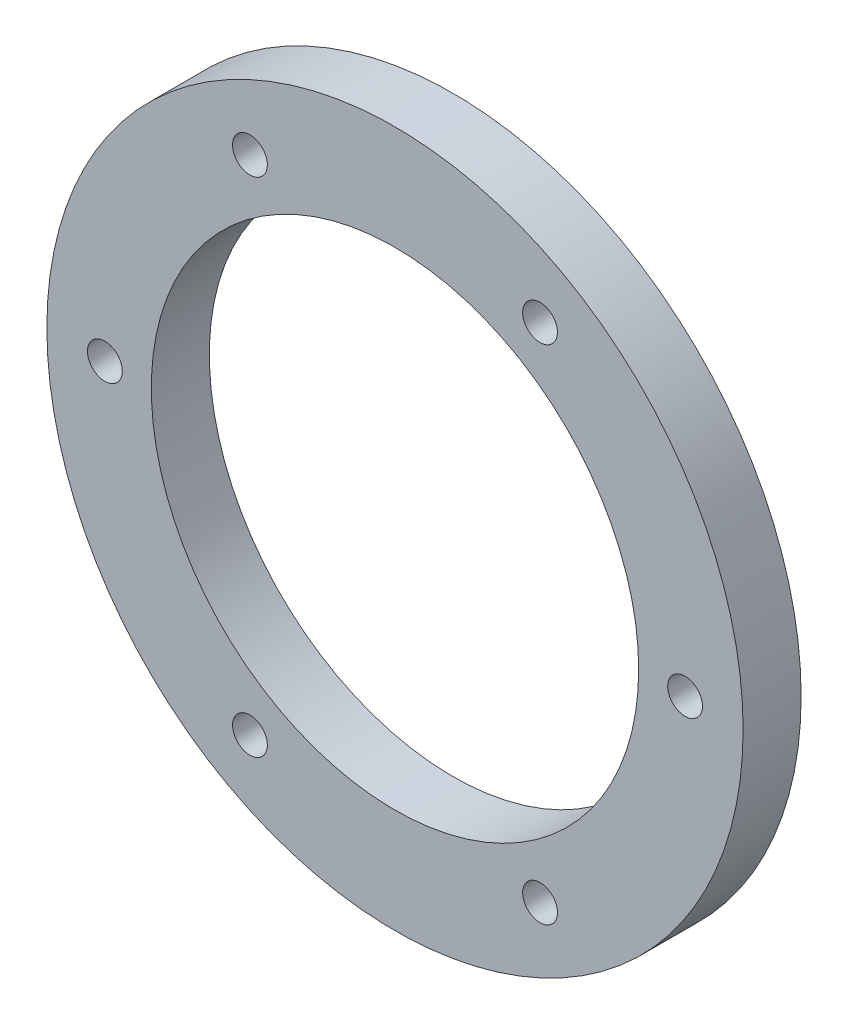
ISO-10303-21;
HEADER;
FILE_DESCRIPTION(('STEP AP214'),'2;1');
FILE_NAME('part.step','',(''),(''),'','','');
FILE_SCHEMA(('AUTOMOTIVE_DESIGN { 1 0 10303 214 1 1 1 1 }'));
ENDSEC;
DATA;
#1=APPLICATION_CONTEXT('core data for automotive mechanical design processes');
#2=APPLICATION_PROTOCOL_DEFINITION('international standard','automotive_design',2000,#1);
#3=PRODUCT_CONTEXT('',#1,'mechanical');
#4=PRODUCT('Part','Part','',(#3));
#5=PRODUCT_RELATED_PRODUCT_CATEGORY('part','',(#4));
#6=PRODUCT_DEFINITION_FORMATION('','',#4);
#7=PRODUCT_DEFINITION_CONTEXT('part definition',#1,'design');
#8=PRODUCT_DEFINITION('design','',#6,#7);
#9=PRODUCT_DEFINITION_SHAPE('','',#8);
#10=(LENGTH_UNIT() NAMED_UNIT(*) SI_UNIT(.MILLI.,.METRE.));
#11=(NAMED_UNIT(*) PLANE_ANGLE_UNIT() SI_UNIT($,.RADIAN.));
#12=(NAMED_UNIT(*) SI_UNIT($,.STERADIAN.) SOLID_ANGLE_UNIT());
#13=UNCERTAINTY_MEASURE_WITH_UNIT(LENGTH_MEASURE(1.E-05),#10,'distance_accuracy_value','');
#14=(GEOMETRIC_REPRESENTATION_CONTEXT(3) GLOBAL_UNCERTAINTY_ASSIGNED_CONTEXT((#13)) GLOBAL_UNIT_ASSIGNED_CONTEXT((#10,
#11,#12)) REPRESENTATION_CONTEXT('',''));
#15=CARTESIAN_POINT('',(0.,0.,0.));
#16=DIRECTION('',(0.,0.,1.));
#17=DIRECTION('',(1.,0.,0.));
#18=AXIS2_PLACEMENT_3D('',#15,#16,#17);
#19=CARTESIAN_POINT('',(0.,0.,5.));
#20=DIRECTION('',(0.,0.,1.));
#21=DIRECTION('',(1.,0.,0.));
#22=AXIS2_PLACEMENT_3D('',#19,#20,#21);
#23=PLANE('',#22);
#24=CARTESIAN_POINT('',(25.,0.,5.));
#25=DIRECTION('',(0.,0.,1.));
#26=DIRECTION('',(1.,0.,0.));
#27=AXIS2_PLACEMENT_3D('',#24,#25,#26);
#28=CIRCLE('',#27,1.5);
#29=CARTESIAN_POINT('',(26.5,0.,5.));
#30=VERTEX_POINT('',#29);
#31=EDGE_CURVE('E72',#30,#30,#28,.T.);
#32=ORIENTED_EDGE('',*,*,#31,.F.);
#33=EDGE_LOOP('',(#32));
#34=FACE_BOUND('',#33,.T.);
#35=CARTESIAN_POINT('',(-12.4999999999999,-21.650635094611,5.));
#36=DIRECTION('',(0.,0.,1.));
#37=DIRECTION('',(1.,0.,0.));
#38=AXIS2_PLACEMENT_3D('',#35,#36,#37);
#39=CIRCLE('',#38,1.5);
#40=CARTESIAN_POINT('',(-10.9999999999999,-21.650635094611,5.));
#41=VERTEX_POINT('',#40);
#42=EDGE_CURVE('E60',#41,#41,#39,.T.);
#43=ORIENTED_EDGE('',*,*,#42,.F.);
#44=EDGE_LOOP('',(#43));
#45=FACE_BOUND('',#44,.T.);
#46=CARTESIAN_POINT('',(-12.5000000000001,21.6506350946109,5.));
#47=DIRECTION('',(0.,0.,1.));
#48=DIRECTION('',(1.,0.,0.));
#49=AXIS2_PLACEMENT_3D('',#46,#47,#48);
#50=CIRCLE('',#49,1.50000000000001);
#51=CARTESIAN_POINT('',(-11.0000000000001,21.6506350946109,5.));
#52=VERTEX_POINT('',#51);
#53=EDGE_CURVE('E48',#52,#52,#50,.T.);
#54=ORIENTED_EDGE('',*,*,#53,.F.);
#55=EDGE_LOOP('',(#54));
#56=FACE_BOUND('',#55,.T.);
#57=CARTESIAN_POINT('',(0.,0.,5.));
#58=DIRECTION('',(0.,0.,1.));
#59=DIRECTION('',(1.,0.,0.));
#60=AXIS2_PLACEMENT_3D('',#57,#58,#59);
#61=CIRCLE('',#60,30.);
#62=CARTESIAN_POINT('',(30.,0.,5.));
#63=VERTEX_POINT('',#62);
#64=EDGE_CURVE('E10',#63,#63,#61,.T.);
#65=ORIENTED_EDGE('',*,*,#64,.T.);
#66=EDGE_LOOP('',(#65));
#67=FACE_BOUND('',#66,.T.);
#68=CARTESIAN_POINT('',(0.,0.,5.));
#69=DIRECTION('',(0.,0.,1.));
#70=DIRECTION('',(1.,0.,0.));
#71=AXIS2_PLACEMENT_3D('',#68,#69,#70);
#72=CIRCLE('',#71,21.);
#73=CARTESIAN_POINT('',(21.,0.,5.));
#74=VERTEX_POINT('',#73);
#75=EDGE_CURVE('E43',#74,#74,#72,.T.);
#76=ORIENTED_EDGE('',*,*,#75,.F.);
#77=EDGE_LOOP('',(#76));
#78=FACE_BOUND('',#77,.T.);
#79=CARTESIAN_POINT('',(-25.,0.,5.));
#80=DIRECTION('',(0.,0.,1.));
#81=DIRECTION('',(1.,0.,0.));
#82=AXIS2_PLACEMENT_3D('',#79,#80,#81);
#83=CIRCLE('',#82,1.5);
#84=CARTESIAN_POINT('',(-23.5,0.,5.));
#85=VERTEX_POINT('',#84);
#86=EDGE_CURVE('E54',#85,#85,#83,.T.);
#87=ORIENTED_EDGE('',*,*,#86,.F.);
#88=EDGE_LOOP('',(#87));
#89=FACE_BOUND('',#88,.T.);
#90=CARTESIAN_POINT('',(12.5000000000001,-21.6506350946109,5.));
#91=DIRECTION('',(0.,0.,1.));
#92=DIRECTION('',(1.,0.,0.));
#93=AXIS2_PLACEMENT_3D('',#90,#91,#92);
#94=CIRCLE('',#93,1.5);
#95=CARTESIAN_POINT('',(14.0000000000001,-21.6506350946109,5.));
#96=VERTEX_POINT('',#95);
#97=EDGE_CURVE('E66',#96,#96,#94,.T.);
#98=ORIENTED_EDGE('',*,*,#97,.F.);
#99=EDGE_LOOP('',(#98));
#100=FACE_BOUND('',#99,.T.);
#101=CARTESIAN_POINT('',(12.4999999999999,21.650635094611,5.));
#102=DIRECTION('',(0.,0.,1.));
#103=DIRECTION('',(1.,0.,0.));
#104=AXIS2_PLACEMENT_3D('',#101,#102,#103);
#105=CIRCLE('',#104,1.5);
#106=CARTESIAN_POINT('',(13.9999999999999,21.650635094611,5.));
#107=VERTEX_POINT('',#106);
#108=EDGE_CURVE('E78',#107,#107,#105,.T.);
#109=ORIENTED_EDGE('',*,*,#108,.F.);
#110=EDGE_LOOP('',(#109));
#111=FACE_BOUND('',#110,.T.);
#112=ADVANCED_FACE('F32',(#34,#45,#56,#67,#78,#89,#100,#111),#23,.T.);
#113=CARTESIAN_POINT('',(0.,0.,0.));
#114=DIRECTION('',(0.,0.,1.));
#115=DIRECTION('',(1.,0.,0.));
#116=AXIS2_PLACEMENT_3D('',#113,#114,#115);
#117=PLANE('',#116);
#118=CARTESIAN_POINT('',(0.,0.,0.));
#119=DIRECTION('',(0.,0.,1.));
#120=DIRECTION('',(1.,0.,0.));
#121=AXIS2_PLACEMENT_3D('',#118,#119,#120);
#122=CIRCLE('',#121,30.);
#123=CARTESIAN_POINT('',(30.,0.,0.));
#124=VERTEX_POINT('',#123);
#125=EDGE_CURVE('E36',#124,#124,#122,.T.);
#126=ORIENTED_EDGE('',*,*,#125,.F.);
#127=EDGE_LOOP('',(#126));
#128=FACE_BOUND('',#127,.T.);
#129=CARTESIAN_POINT('',(0.,0.,0.));
#130=DIRECTION('',(0.,0.,1.));
#131=DIRECTION('',(1.,0.,0.));
#132=AXIS2_PLACEMENT_3D('',#129,#130,#131);
#133=CIRCLE('',#132,21.);
#134=CARTESIAN_POINT('',(21.,0.,0.));
#135=VERTEX_POINT('',#134);
#136=EDGE_CURVE('E45',#135,#135,#133,.T.);
#137=ORIENTED_EDGE('',*,*,#136,.T.);
#138=EDGE_LOOP('',(#137));
#139=FACE_BOUND('',#138,.T.);
#140=CARTESIAN_POINT('',(-12.5000000000001,21.6506350946109,0.));
#141=DIRECTION('',(0.,0.,1.));
#142=DIRECTION('',(1.,0.,0.));
#143=AXIS2_PLACEMENT_3D('',#140,#141,#142);
#144=CIRCLE('',#143,1.50000000000001);
#145=CARTESIAN_POINT('',(-11.0000000000001,21.6506350946109,0.));
#146=VERTEX_POINT('',#145);
#147=EDGE_CURVE('E51',#146,#146,#144,.T.);
#148=ORIENTED_EDGE('',*,*,#147,.T.);
#149=EDGE_LOOP('',(#148));
#150=FACE_BOUND('',#149,.T.);
#151=CARTESIAN_POINT('',(-25.,0.,0.));
#152=DIRECTION('',(0.,0.,1.));
#153=DIRECTION('',(1.,0.,0.));
#154=AXIS2_PLACEMENT_3D('',#151,#152,#153);
#155=CIRCLE('',#154,1.5);
#156=CARTESIAN_POINT('',(-23.5,0.,0.));
#157=VERTEX_POINT('',#156);
#158=EDGE_CURVE('E57',#157,#157,#155,.T.);
#159=ORIENTED_EDGE('',*,*,#158,.T.);
#160=EDGE_LOOP('',(#159));
#161=FACE_BOUND('',#160,.T.);
#162=CARTESIAN_POINT('',(-12.4999999999999,-21.650635094611,0.));
#163=DIRECTION('',(0.,0.,1.));
#164=DIRECTION('',(1.,0.,0.));
#165=AXIS2_PLACEMENT_3D('',#162,#163,#164);
#166=CIRCLE('',#165,1.5);
#167=CARTESIAN_POINT('',(-10.9999999999999,-21.650635094611,0.));
#168=VERTEX_POINT('',#167);
#169=EDGE_CURVE('E63',#168,#168,#166,.T.);
#170=ORIENTED_EDGE('',*,*,#169,.T.);
#171=EDGE_LOOP('',(#170));
#172=FACE_BOUND('',#171,.T.);
#173=CARTESIAN_POINT('',(12.5000000000001,-21.6506350946109,0.));
#174=DIRECTION('',(0.,0.,1.));
#175=DIRECTION('',(1.,0.,0.));
#176=AXIS2_PLACEMENT_3D('',#173,#174,#175);
#177=CIRCLE('',#176,1.5);
#178=CARTESIAN_POINT('',(14.0000000000001,-21.6506350946109,0.));
#179=VERTEX_POINT('',#178);
#180=EDGE_CURVE('E69',#179,#179,#177,.T.);
#181=ORIENTED_EDGE('',*,*,#180,.T.);
#182=EDGE_LOOP('',(#181));
#183=FACE_BOUND('',#182,.T.);
#184=CARTESIAN_POINT('',(25.,0.,0.));
#185=DIRECTION('',(0.,0.,1.));
#186=DIRECTION('',(1.,0.,0.));
#187=AXIS2_PLACEMENT_3D('',#184,#185,#186);
#188=CIRCLE('',#187,1.5);
#189=CARTESIAN_POINT('',(26.5,0.,0.));
#190=VERTEX_POINT('',#189);
#191=EDGE_CURVE('E75',#190,#190,#188,.T.);
#192=ORIENTED_EDGE('',*,*,#191,.T.);
#193=EDGE_LOOP('',(#192));
#194=FACE_BOUND('',#193,.T.);
#195=CARTESIAN_POINT('',(12.4999999999999,21.650635094611,0.));
#196=DIRECTION('',(0.,0.,1.));
#197=DIRECTION('',(1.,0.,0.));
#198=AXIS2_PLACEMENT_3D('',#195,#196,#197);
#199=CIRCLE('',#198,1.5);
#200=CARTESIAN_POINT('',(13.9999999999999,21.650635094611,0.));
#201=VERTEX_POINT('',#200);
#202=EDGE_CURVE('E81',#201,#201,#199,.T.);
#203=ORIENTED_EDGE('',*,*,#202,.T.);
#204=EDGE_LOOP('',(#203));
#205=FACE_BOUND('',#204,.T.);
#206=ADVANCED_FACE('F91',(#128,#139,#150,#161,#172,#183,#194,#205),#117,.F.);
#207=CARTESIAN_POINT('',(0.,0.,5.));
#208=DIRECTION('',(0.,0.,-1.));
#209=DIRECTION('',(-1.,0.,0.));
#210=AXIS2_PLACEMENT_3D('',#207,#208,#209);
#211=CYLINDRICAL_SURFACE('',#210,30.);
#212=ORIENTED_EDGE('',*,*,#64,.F.);
#213=EDGE_LOOP('',(#212));
#214=FACE_BOUND('',#213,.T.);
#215=ORIENTED_EDGE('',*,*,#125,.T.);
#216=EDGE_LOOP('',(#215));
#217=FACE_BOUND('',#216,.T.);
#218=ADVANCED_FACE('F34',(#214,#217),#211,.T.);
#219=CARTESIAN_POINT('',(0.,0.,5.));
#220=DIRECTION('',(0.,0.,-1.));
#221=DIRECTION('',(-1.,0.,0.));
#222=AXIS2_PLACEMENT_3D('',#219,#220,#221);
#223=CYLINDRICAL_SURFACE('',#222,21.);
#224=ORIENTED_EDGE('',*,*,#75,.T.);
#225=EDGE_LOOP('',(#224));
#226=FACE_BOUND('',#225,.T.);
#227=ORIENTED_EDGE('',*,*,#136,.F.);
#228=EDGE_LOOP('',(#227));
#229=FACE_BOUND('',#228,.T.);
#230=ADVANCED_FACE('F101',(#226,#229),#223,.F.);
#231=CARTESIAN_POINT('',(-12.5000000000001,21.6506350946109,5.));
#232=DIRECTION('',(0.,0.,-1.));
#233=DIRECTION('',(-1.,0.,0.));
#234=AXIS2_PLACEMENT_3D('',#231,#232,#233);
#235=CYLINDRICAL_SURFACE('',#234,1.50000000000001);
#236=ORIENTED_EDGE('',*,*,#53,.T.);
#237=EDGE_LOOP('',(#236));
#238=FACE_BOUND('',#237,.T.);
#239=ORIENTED_EDGE('',*,*,#147,.F.);
#240=EDGE_LOOP('',(#239));
#241=FACE_BOUND('',#240,.T.);
#242=ADVANCED_FACE('F104',(#238,#241),#235,.F.);
#243=CARTESIAN_POINT('',(-25.,0.,5.));
#244=DIRECTION('',(0.,0.,-1.));
#245=DIRECTION('',(-1.,0.,0.));
#246=AXIS2_PLACEMENT_3D('',#243,#244,#245);
#247=CYLINDRICAL_SURFACE('',#246,1.5);
#248=ORIENTED_EDGE('',*,*,#86,.T.);
#249=EDGE_LOOP('',(#248));
#250=FACE_BOUND('',#249,.T.);
#251=ORIENTED_EDGE('',*,*,#158,.F.);
#252=EDGE_LOOP('',(#251));
#253=FACE_BOUND('',#252,.T.);
#254=ADVANCED_FACE('F108',(#250,#253),#247,.F.);
#255=CARTESIAN_POINT('',(-12.4999999999999,-21.650635094611,5.));
#256=DIRECTION('',(0.,0.,-1.));
#257=DIRECTION('',(-1.,0.,0.));
#258=AXIS2_PLACEMENT_3D('',#255,#256,#257);
#259=CYLINDRICAL_SURFACE('',#258,1.5);
#260=ORIENTED_EDGE('',*,*,#42,.T.);
#261=EDGE_LOOP('',(#260));
#262=FACE_BOUND('',#261,.T.);
#263=ORIENTED_EDGE('',*,*,#169,.F.);
#264=EDGE_LOOP('',(#263));
#265=FACE_BOUND('',#264,.T.);
#266=ADVANCED_FACE('F112',(#262,#265),#259,.F.);
#267=CARTESIAN_POINT('',(12.5000000000001,-21.6506350946109,5.));
#268=DIRECTION('',(0.,0.,-1.));
#269=DIRECTION('',(-1.,0.,0.));
#270=AXIS2_PLACEMENT_3D('',#267,#268,#269);
#271=CYLINDRICAL_SURFACE('',#270,1.5);
#272=ORIENTED_EDGE('',*,*,#97,.T.);
#273=EDGE_LOOP('',(#272));
#274=FACE_BOUND('',#273,.T.);
#275=ORIENTED_EDGE('',*,*,#180,.F.);
#276=EDGE_LOOP('',(#275));
#277=FACE_BOUND('',#276,.T.);
#278=ADVANCED_FACE('F116',(#274,#277),#271,.F.);
#279=CARTESIAN_POINT('',(25.,0.,5.));
#280=DIRECTION('',(0.,0.,-1.));
#281=DIRECTION('',(-1.,0.,0.));
#282=AXIS2_PLACEMENT_3D('',#279,#280,#281);
#283=CYLINDRICAL_SURFACE('',#282,1.5);
#284=ORIENTED_EDGE('',*,*,#31,.T.);
#285=EDGE_LOOP('',(#284));
#286=FACE_BOUND('',#285,.T.);
#287=ORIENTED_EDGE('',*,*,#191,.F.);
#288=EDGE_LOOP('',(#287));
#289=FACE_BOUND('',#288,.T.);
#290=ADVANCED_FACE('F120',(#286,#289),#283,.F.);
#291=CARTESIAN_POINT('',(12.4999999999999,21.650635094611,5.));
#292=DIRECTION('',(0.,0.,-1.));
#293=DIRECTION('',(-1.,0.,0.));
#294=AXIS2_PLACEMENT_3D('',#291,#292,#293);
#295=CYLINDRICAL_SURFACE('',#294,1.5);
#296=ORIENTED_EDGE('',*,*,#108,.T.);
#297=EDGE_LOOP('',(#296));
#298=FACE_BOUND('',#297,.T.);
#299=ORIENTED_EDGE('',*,*,#202,.F.);
#300=EDGE_LOOP('',(#299));
#301=FACE_BOUND('',#300,.T.);
#302=ADVANCED_FACE('F87',(#298,#301),#295,.F.);
#303=CLOSED_SHELL('',(#112,#206,#218,#230,#242,#254,#266,#278,#290,#302));
#304=MANIFOLD_SOLID_BREP('B2',#303);
#305=ADVANCED_BREP_SHAPE_REPRESENTATION('',(#18,#304),#14);
#306=SHAPE_DEFINITION_REPRESENTATION(#9,#305);
ENDSEC;
END-ISO-10303-21;
